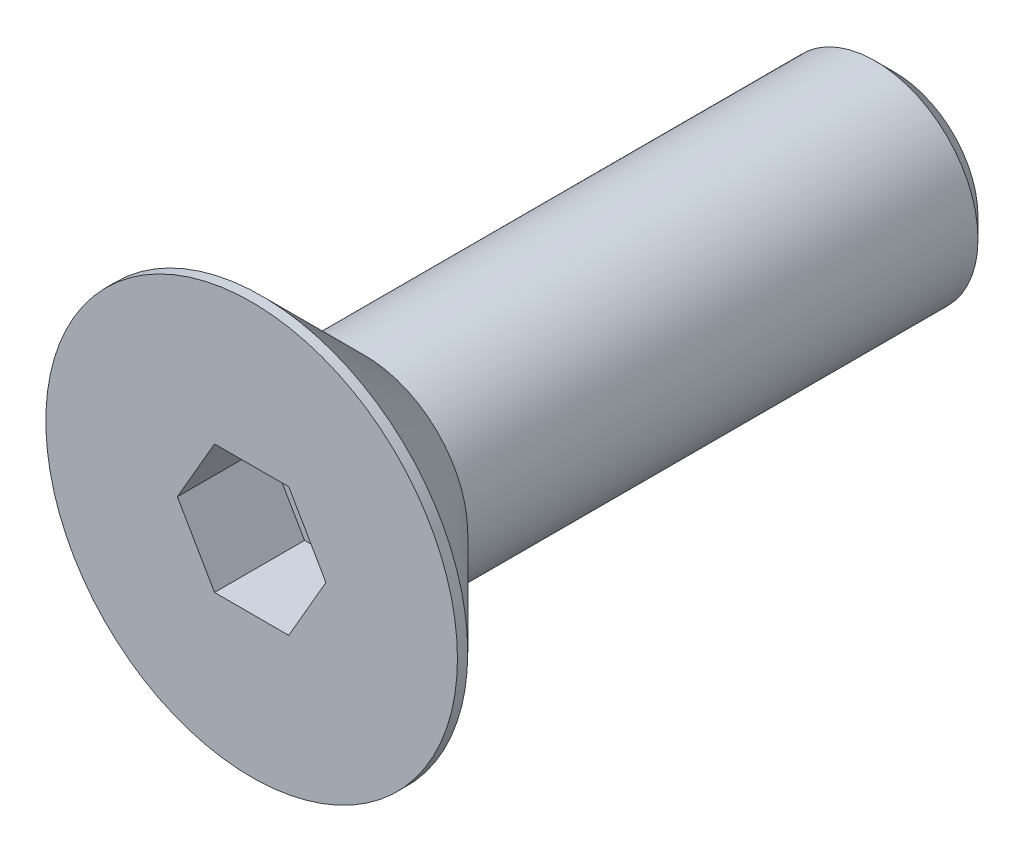
ISO-10303-21;
HEADER;
FILE_DESCRIPTION(('STEP AP214'),'2;1');
FILE_NAME('part.step','',(''),(''),'','','');
FILE_SCHEMA(('AUTOMOTIVE_DESIGN { 1 0 10303 214 1 1 1 1 }'));
ENDSEC;
DATA;
#1=APPLICATION_CONTEXT('core data for automotive mechanical design processes');
#2=APPLICATION_PROTOCOL_DEFINITION('international standard','automotive_design',2000,#1);
#3=PRODUCT_CONTEXT('',#1,'mechanical');
#4=PRODUCT('Part','Part','',(#3));
#5=PRODUCT_RELATED_PRODUCT_CATEGORY('part','',(#4));
#6=PRODUCT_DEFINITION_FORMATION('','',#4);
#7=PRODUCT_DEFINITION_CONTEXT('part definition',#1,'design');
#8=PRODUCT_DEFINITION('design','',#6,#7);
#9=PRODUCT_DEFINITION_SHAPE('','',#8);
#10=(LENGTH_UNIT() NAMED_UNIT(*) SI_UNIT(.MILLI.,.METRE.));
#11=(NAMED_UNIT(*) PLANE_ANGLE_UNIT() SI_UNIT($,.RADIAN.));
#12=(NAMED_UNIT(*) SI_UNIT($,.STERADIAN.) SOLID_ANGLE_UNIT());
#13=UNCERTAINTY_MEASURE_WITH_UNIT(LENGTH_MEASURE(1.E-05),#10,'distance_accuracy_value','');
#14=(GEOMETRIC_REPRESENTATION_CONTEXT(3) GLOBAL_UNCERTAINTY_ASSIGNED_CONTEXT((#13)) GLOBAL_UNIT_ASSIGNED_CONTEXT((#10,
#11,#12)) REPRESENTATION_CONTEXT('',''));
#15=CARTESIAN_POINT('',(0.,0.,0.));
#16=DIRECTION('',(0.,0.,1.));
#17=DIRECTION('',(1.,0.,0.));
#18=AXIS2_PLACEMENT_3D('',#15,#16,#17);
#19=CARTESIAN_POINT('',(0.,0.,4.4));
#20=DIRECTION('',(0.,0.,0.999999999999993));
#21=DIRECTION('',(-1.,0.,0.));
#22=AXIS2_PLACEMENT_3D('',#19,#20,#21);
#23=PLANE('',#22);
#24=CARTESIAN_POINT('',(0.,0.,4.4));
#25=DIRECTION('',(0.,0.,0.999999999999993));
#26=DIRECTION('',(1.,0.,0.));
#27=AXIS2_PLACEMENT_3D('',#24,#25,#26);
#28=CIRCLE('',#27,8.);
#29=CARTESIAN_POINT('',(7.99999999999923,7.7715611723761E-13,4.39999999999996));
#30=VERTEX_POINT('',#29);
#31=EDGE_CURVE('E11',#30,#30,#28,.T.);
#32=ORIENTED_EDGE('',*,*,#31,.T.);
#33=EDGE_LOOP('',(#32));
#34=FACE_BOUND('',#33,.T.);
#35=DIRECTION('',(-1.,0.,0.));
#36=VECTOR('',#35,1.);
#37=CARTESIAN_POINT('',(0.360843918248421,-2.49999999999984,4.4));
#38=LINE('',#37,#36);
#39=CARTESIAN_POINT('',(1.44337567299979,-2.50000000000017,4.4));
#40=VERTEX_POINT('',#39);
#41=CARTESIAN_POINT('',(-1.4433756730009,-2.49999999999995,4.4));
#42=VERTEX_POINT('',#41);
#43=EDGE_CURVE('E131',#40,#42,#38,.T.);
#44=ORIENTED_EDGE('',*,*,#43,.T.);
#45=DIRECTION('',(-0.499999999980764,0.86602540379555,0.));
#46=VECTOR('',#45,1.);
#47=CARTESIAN_POINT('',(-2.16506350946655,-1.24999999997322,4.4));
#48=LINE('',#47,#46);
#49=CARTESIAN_POINT('',(-2.88675134590066,5.55111512312578E-13,4.4));
#50=VERTEX_POINT('',#49);
#51=EDGE_CURVE('E89',#42,#50,#48,.T.);
#52=ORIENTED_EDGE('',*,*,#51,.T.);
#53=DIRECTION('',(0.499999999980753,0.866025403795543,0.));
#54=VECTOR('',#53,1.);
#55=CARTESIAN_POINT('',(-2.16506350946633,1.24999999997366,4.4));
#56=LINE('',#55,#54);
#57=CARTESIAN_POINT('',(-1.44337567300123,2.50000000000039,4.4));
#58=VERTEX_POINT('',#57);
#59=EDGE_CURVE('E137',#50,#58,#56,.T.);
#60=ORIENTED_EDGE('',*,*,#59,.T.);
#61=DIRECTION('',(1.,0.,0.));
#62=VECTOR('',#61,1.);
#63=CARTESIAN_POINT('',(-1.4432899320127E-12,2.50000000000017,4.39999999999996));
#64=LINE('',#63,#62);
#65=CARTESIAN_POINT('',(1.44337567299901,2.5000000000005,4.39999999999996));
#66=VERTEX_POINT('',#65);
#67=EDGE_CURVE('E98',#58,#66,#64,.T.);
#68=ORIENTED_EDGE('',*,*,#67,.T.);
#69=DIRECTION('',(0.499999999980764,-0.86602540379555,0.));
#70=VECTOR('',#69,1.);
#71=CARTESIAN_POINT('',(2.16506350946466,1.24999999997344,4.39999999999996));
#72=LINE('',#71,#70);
#73=CARTESIAN_POINT('',(2.88675134589866,-1.11022302462516E-13,4.39999999999996));
#74=VERTEX_POINT('',#73);
#75=EDGE_CURVE('E164',#66,#74,#72,.T.);
#76=ORIENTED_EDGE('',*,*,#75,.T.);
#77=DIRECTION('',(-0.499999999980753,-0.866025403795543,0.));
#78=VECTOR('',#77,1.);
#79=CARTESIAN_POINT('',(2.16506350946488,-1.24999999997355,4.4));
#80=LINE('',#79,#78);
#81=EDGE_CURVE('E121',#74,#40,#80,.T.);
#82=ORIENTED_EDGE('',*,*,#81,.T.);
#83=EDGE_LOOP('',(#44,#52,#60,#68,#76,#82));
#84=FACE_BOUND('',#83,.T.);
#85=ADVANCED_FACE('F16',(#34,#84),#23,.T.);
#86=CARTESIAN_POINT('',(0.,0.,2.19999999999999));
#87=DIRECTION('',(0.,0.,0.999999999999993));
#88=DIRECTION('',(1.,0.,0.));
#89=AXIS2_PLACEMENT_3D('',#86,#87,#88);
#90=CYLINDRICAL_SURFACE('',#89,8.);
#91=ORIENTED_EDGE('',*,*,#31,.F.);
#92=EDGE_LOOP('',(#91));
#93=FACE_BOUND('',#92,.T.);
#94=CARTESIAN_POINT('',(0.,0.,4.));
#95=DIRECTION('',(0.,0.,0.999999999999993));
#96=DIRECTION('',(1.,0.,0.));
#97=AXIS2_PLACEMENT_3D('',#94,#95,#96);
#98=CIRCLE('',#97,8.);
#99=CARTESIAN_POINT('',(7.99999999999923,7.7715611723761E-13,3.99999999999996));
#100=VERTEX_POINT('',#99);
#101=EDGE_CURVE('E27',#100,#100,#98,.T.);
#102=ORIENTED_EDGE('',*,*,#101,.T.);
#103=EDGE_LOOP('',(#102));
#104=FACE_BOUND('',#103,.T.);
#105=ADVANCED_FACE('F18',(#93,#104),#90,.T.);
#106=CARTESIAN_POINT('',(0.,0.,2.));
#107=DIRECTION('',(0.,0.,0.999999999999993));
#108=DIRECTION('',(1.,0.,0.));
#109=AXIS2_PLACEMENT_3D('',#106,#107,#108);
#110=CONICAL_SURFACE('',#109,6.,0.785398163397448);
#111=CARTESIAN_POINT('',(0.,0.,0.));
#112=DIRECTION('',(0.,0.,-0.999999999999993));
#113=DIRECTION('',(1.,0.,0.));
#114=AXIS2_PLACEMENT_3D('',#111,#112,#113);
#115=CIRCLE('',#114,4.);
#116=CARTESIAN_POINT('',(3.99999999999923,3.33066907387547E-13,0.));
#117=VERTEX_POINT('',#116);
#118=EDGE_CURVE('E87',#117,#117,#115,.T.);
#119=ORIENTED_EDGE('',*,*,#118,.F.);
#120=EDGE_LOOP('',(#119));
#121=FACE_BOUND('',#120,.T.);
#122=ORIENTED_EDGE('',*,*,#101,.F.);
#123=EDGE_LOOP('',(#122));
#124=FACE_BOUND('',#123,.T.);
#125=ADVANCED_FACE('F195',(#121,#124),#110,.T.);
#126=CARTESIAN_POINT('',(0.,0.,-20.6));
#127=DIRECTION('',(0.,0.,-0.999999999999993));
#128=DIRECTION('',(1.,0.,0.));
#129=AXIS2_PLACEMENT_3D('',#126,#127,#128);
#130=PLANE('',#129);
#131=CARTESIAN_POINT('',(0.,0.,-20.6));
#132=DIRECTION('',(0.,0.,-0.999999999999993));
#133=DIRECTION('',(1.,0.,0.));
#134=AXIS2_PLACEMENT_3D('',#131,#132,#133);
#135=CIRCLE('',#134,3.2332);
#136=CARTESIAN_POINT('',(3.23319999999883,2.22044604925031E-13,-20.6));
#137=VERTEX_POINT('',#136);
#138=EDGE_CURVE('E80',#137,#137,#135,.T.);
#139=ORIENTED_EDGE('',*,*,#138,.T.);
#140=EDGE_LOOP('',(#139));
#141=FACE_BOUND('',#140,.T.);
#142=ADVANCED_FACE('F198',(#141),#130,.T.);
#143=CARTESIAN_POINT('',(0.,0.,-8.1));
#144=DIRECTION('',(0.,0.,0.999999999999993));
#145=DIRECTION('',(1.,0.,0.));
#146=AXIS2_PLACEMENT_3D('',#143,#144,#145);
#147=CYLINDRICAL_SURFACE('',#146,4.);
#148=ORIENTED_EDGE('',*,*,#118,.T.);
#149=EDGE_LOOP('',(#148));
#150=FACE_BOUND('',#149,.T.);
#151=CARTESIAN_POINT('',(0.,0.,-19.8332));
#152=DIRECTION('',(0.,0.,0.999999999999993));
#153=DIRECTION('',(1.,0.,0.));
#154=AXIS2_PLACEMENT_3D('',#151,#152,#153);
#155=CIRCLE('',#154,4.);
#156=CARTESIAN_POINT('',(3.99999999999945,8.88178419700125E-13,-19.8332));
#157=VERTEX_POINT('',#156);
#158=EDGE_CURVE('E76',#157,#157,#155,.T.);
#159=ORIENTED_EDGE('',*,*,#158,.T.);
#160=EDGE_LOOP('',(#159));
#161=FACE_BOUND('',#160,.T.);
#162=ADVANCED_FACE('F77',(#150,#161),#147,.T.);
#163=CARTESIAN_POINT('',(0.,0.,-20.2166));
#164=DIRECTION('',(0.,0.,0.999999999999993));
#165=DIRECTION('',(1.,0.,0.));
#166=AXIS2_PLACEMENT_3D('',#163,#164,#165);
#167=CONICAL_SURFACE('',#166,3.6166,0.785398163397448);
#168=ORIENTED_EDGE('',*,*,#138,.F.);
#169=EDGE_LOOP('',(#168));
#170=FACE_BOUND('',#169,.T.);
#171=ORIENTED_EDGE('',*,*,#158,.F.);
#172=EDGE_LOOP('',(#171));
#173=FACE_BOUND('',#172,.T.);
#174=ADVANCED_FACE('F211',(#170,#173),#167,.T.);
#175=CARTESIAN_POINT('',(0.,0.,0.899999999999998));
#176=DIRECTION('',(0.,0.,-0.999999999999993));
#177=DIRECTION('',(0.,-0.999999999999999,0.));
#178=AXIS2_PLACEMENT_3D('',#175,#176,#177);
#179=PLANE('',#178);
#180=DIRECTION('',(1.,0.,0.));
#181=VECTOR('',#180,1.);
#182=CARTESIAN_POINT('',(-4.44089209850063E-13,-2.4999999999995,0.899999999999998));
#183=LINE('',#182,#181);
#184=CARTESIAN_POINT('',(-1.44337567300123,-2.49999999999972,0.899999999999998));
#185=VERTEX_POINT('',#184);
#186=CARTESIAN_POINT('',(1.44337567299979,-2.50000000000017,0.899999999999998));
#187=VERTEX_POINT('',#186);
#188=EDGE_CURVE('E153',#185,#187,#183,.T.);
#189=ORIENTED_EDGE('',*,*,#188,.T.);
#190=DIRECTION('',(0.499999999980753,0.866025403795543,0.));
#191=VECTOR('',#190,1.);
#192=CARTESIAN_POINT('',(2.88675134589866,-1.11022302462516E-13,0.899999999999956));
#193=LINE('',#192,#191);
#194=CARTESIAN_POINT('',(2.88675134589866,-1.11022302462516E-13,0.899999999999956));
#195=VERTEX_POINT('',#194);
#196=EDGE_CURVE('E20',#187,#195,#193,.T.);
#197=ORIENTED_EDGE('',*,*,#196,.T.);
#198=DIRECTION('',(-0.499999999980764,0.86602540379555,0.));
#199=VECTOR('',#198,1.);
#200=CARTESIAN_POINT('',(1.44337567299901,2.5000000000005,0.899999999999956));
#201=LINE('',#200,#199);
#202=CARTESIAN_POINT('',(1.44337567299901,2.5000000000005,0.899999999999956));
#203=VERTEX_POINT('',#202);
#204=EDGE_CURVE('E122',#195,#203,#201,.T.);
#205=ORIENTED_EDGE('',*,*,#204,.T.);
#206=DIRECTION('',(-1.,0.,0.));
#207=VECTOR('',#206,1.);
#208=CARTESIAN_POINT('',(-1.44337567300135,2.50000000000061,0.899999999999998));
#209=LINE('',#208,#207);
#210=CARTESIAN_POINT('',(-1.44337567300135,2.50000000000061,0.899999999999998));
#211=VERTEX_POINT('',#210);
#212=EDGE_CURVE('E97',#203,#211,#209,.T.);
#213=ORIENTED_EDGE('',*,*,#212,.T.);
#214=DIRECTION('',(-0.499999999980753,-0.866025403795543,0.));
#215=VECTOR('',#214,1.);
#216=CARTESIAN_POINT('',(-2.88675134590066,5.55111512312578E-13,0.899999999999998));
#217=LINE('',#216,#215);
#218=CARTESIAN_POINT('',(-2.88675134590066,5.55111512312578E-13,0.899999999999998));
#219=VERTEX_POINT('',#218);
#220=EDGE_CURVE('E123',#211,#219,#217,.T.);
#221=ORIENTED_EDGE('',*,*,#220,.T.);
#222=DIRECTION('',(0.499999999980764,-0.86602540379555,0.));
#223=VECTOR('',#222,1.);
#224=CARTESIAN_POINT('',(-1.44337567300123,-2.49999999999972,0.899999999999998));
#225=LINE('',#224,#223);
#226=EDGE_CURVE('E81',#219,#185,#225,.T.);
#227=ORIENTED_EDGE('',*,*,#226,.T.);
#228=EDGE_LOOP('',(#189,#197,#205,#213,#221,#227));
#229=FACE_BOUND('',#228,.T.);
#230=ADVANCED_FACE('F172',(#229),#179,.F.);
#231=CARTESIAN_POINT('',(-2.16506350945089,-1.24999999999975,5.4));
#232=DIRECTION('',(-0.866025403795546,-0.49999999998075,0.));
#233=DIRECTION('',(-0.499999999980764,0.86602540379555,0.));
#234=AXIS2_PLACEMENT_3D('',#231,#232,#233);
#235=PLANE('',#234);
#236=ORIENTED_EDGE('',*,*,#51,.F.);
#237=DIRECTION('',(0.,0.,-0.999999999999993));
#238=VECTOR('',#237,1.);
#239=CARTESIAN_POINT('',(-1.4433756730009,-2.49999999999995,5.4));
#240=LINE('',#239,#238);
#241=EDGE_CURVE('E150',#42,#185,#240,.T.);
#242=ORIENTED_EDGE('',*,*,#241,.T.);
#243=ORIENTED_EDGE('',*,*,#226,.F.);
#244=DIRECTION('',(0.,0.,-0.999999999999993));
#245=VECTOR('',#244,1.);
#246=CARTESIAN_POINT('',(-2.88675134590066,5.55111512312578E-13,5.4));
#247=LINE('',#246,#245);
#248=EDGE_CURVE('E127',#50,#219,#247,.T.);
#249=ORIENTED_EDGE('',*,*,#248,.F.);
#250=EDGE_LOOP('',(#236,#242,#243,#249));
#251=FACE_BOUND('',#250,.T.);
#252=ADVANCED_FACE('F143',(#251),#235,.F.);
#253=CARTESIAN_POINT('',(-2.16506350945067,1.25000000000042,5.4));
#254=DIRECTION('',(-0.866025403795552,0.499999999980764,0.));
#255=DIRECTION('',(0.499999999980753,0.866025403795543,0.));
#256=AXIS2_PLACEMENT_3D('',#253,#254,#255);
#257=PLANE('',#256);
#258=ORIENTED_EDGE('',*,*,#59,.F.);
#259=ORIENTED_EDGE('',*,*,#248,.T.);
#260=ORIENTED_EDGE('',*,*,#220,.F.);
#261=DIRECTION('',(0.,0.,-0.999999999999993));
#262=VECTOR('',#261,1.);
#263=CARTESIAN_POINT('',(-1.44337567300123,2.50000000000039,5.4));
#264=LINE('',#263,#262);
#265=EDGE_CURVE('E94',#58,#211,#264,.T.);
#266=ORIENTED_EDGE('',*,*,#265,.F.);
#267=EDGE_LOOP('',(#258,#259,#260,#266));
#268=FACE_BOUND('',#267,.T.);
#269=ADVANCED_FACE('F148',(#268),#257,.F.);
#270=CARTESIAN_POINT('',(0.721687836499063,-2.49999999999984,5.4));
#271=DIRECTION('',(0.,-0.999999999999999,0.));
#272=DIRECTION('',(-1.,0.,0.));
#273=AXIS2_PLACEMENT_3D('',#270,#271,#272);
#274=PLANE('',#273);
#275=ORIENTED_EDGE('',*,*,#43,.F.);
#276=DIRECTION('',(0.,0.,-0.999999999999993));
#277=VECTOR('',#276,1.);
#278=CARTESIAN_POINT('',(1.44337567299979,-2.50000000000017,5.4));
#279=LINE('',#278,#277);
#280=EDGE_CURVE('E128',#40,#187,#279,.T.);
#281=ORIENTED_EDGE('',*,*,#280,.T.);
#282=ORIENTED_EDGE('',*,*,#188,.F.);
#283=ORIENTED_EDGE('',*,*,#241,.F.);
#284=EDGE_LOOP('',(#275,#281,#282,#283));
#285=FACE_BOUND('',#284,.T.);
#286=ADVANCED_FACE('F200',(#285),#274,.F.);
#287=CARTESIAN_POINT('',(2.16506350944934,-1.24999999999997,5.4));
#288=DIRECTION('',(0.866025403795552,-0.499999999980764,0.));
#289=DIRECTION('',(-0.499999999980753,-0.866025403795543,0.));
#290=AXIS2_PLACEMENT_3D('',#287,#288,#289);
#291=PLANE('',#290);
#292=ORIENTED_EDGE('',*,*,#81,.F.);
#293=DIRECTION('',(0.,0.,-0.999999999999993));
#294=VECTOR('',#293,1.);
#295=CARTESIAN_POINT('',(2.88675134589866,-1.11022302462516E-13,5.39999999999996));
#296=LINE('',#295,#294);
#297=EDGE_CURVE('E117',#74,#195,#296,.T.);
#298=ORIENTED_EDGE('',*,*,#297,.T.);
#299=ORIENTED_EDGE('',*,*,#196,.F.);
#300=ORIENTED_EDGE('',*,*,#280,.F.);
#301=EDGE_LOOP('',(#292,#298,#299,#300));
#302=FACE_BOUND('',#301,.T.);
#303=ADVANCED_FACE('F186',(#302),#291,.F.);
#304=CARTESIAN_POINT('',(2.16506350944945,1.25000000000008,5.39999999999996));
#305=DIRECTION('',(0.866025403795546,0.49999999998075,0.));
#306=DIRECTION('',(0.499999999980764,-0.86602540379555,0.));
#307=AXIS2_PLACEMENT_3D('',#304,#305,#306);
#308=PLANE('',#307);
#309=ORIENTED_EDGE('',*,*,#75,.F.);
#310=DIRECTION('',(0.,0.,-0.999999999999993));
#311=VECTOR('',#310,1.);
#312=CARTESIAN_POINT('',(1.44337567299901,2.5000000000005,5.39999999999996));
#313=LINE('',#312,#311);
#314=EDGE_CURVE('E107',#66,#203,#313,.T.);
#315=ORIENTED_EDGE('',*,*,#314,.T.);
#316=ORIENTED_EDGE('',*,*,#204,.F.);
#317=ORIENTED_EDGE('',*,*,#297,.F.);
#318=EDGE_LOOP('',(#309,#315,#316,#317));
#319=FACE_BOUND('',#318,.T.);
#320=ADVANCED_FACE('F178',(#319),#308,.F.);
#321=CARTESIAN_POINT('',(-1.4432899320127E-12,2.50000000000017,5.39999999999996));
#322=DIRECTION('',(0.,0.999999999999999,0.));
#323=DIRECTION('',(1.,0.,0.));
#324=AXIS2_PLACEMENT_3D('',#321,#322,#323);
#325=PLANE('',#324);
#326=ORIENTED_EDGE('',*,*,#67,.F.);
#327=ORIENTED_EDGE('',*,*,#265,.T.);
#328=ORIENTED_EDGE('',*,*,#212,.F.);
#329=ORIENTED_EDGE('',*,*,#314,.F.);
#330=EDGE_LOOP('',(#326,#327,#328,#329));
#331=FACE_BOUND('',#330,.T.);
#332=ADVANCED_FACE('F179',(#331),#325,.F.);
#333=CLOSED_SHELL('',(#85,#105,#125,#142,#162,#174,#230,#252,#269,#286,#303,#320,#332));
#334=MANIFOLD_SOLID_BREP('B1',#333);
#335=ADVANCED_BREP_SHAPE_REPRESENTATION('',(#18,#334),#14);
#336=SHAPE_DEFINITION_REPRESENTATION(#9,#335);
ENDSEC;
END-ISO-10303-21;
